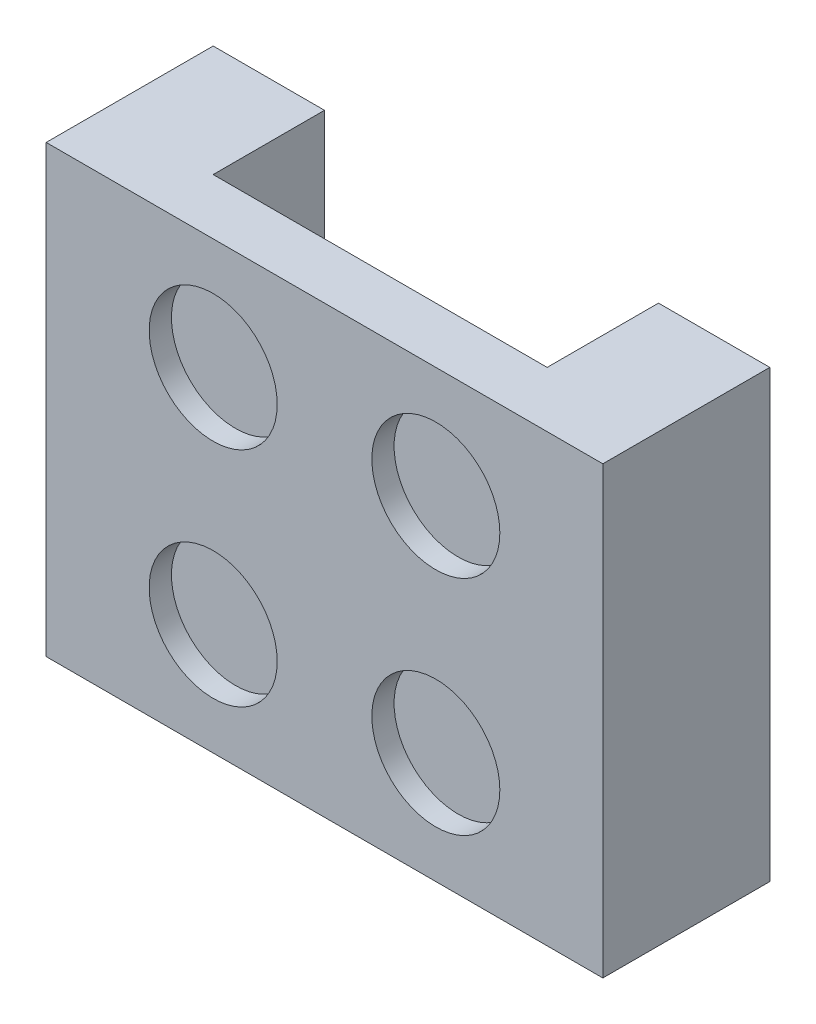
ISO-10303-21;
HEADER;
FILE_DESCRIPTION(('STEP AP214'),'2;1');
FILE_NAME('part.step','',(''),(''),'','','');
FILE_SCHEMA(('AUTOMOTIVE_DESIGN { 1 0 10303 214 1 1 1 1 }'));
ENDSEC;
DATA;
#1=APPLICATION_CONTEXT('core data for automotive mechanical design processes');
#2=APPLICATION_PROTOCOL_DEFINITION('international standard','automotive_design',2000,#1);
#3=PRODUCT_CONTEXT('',#1,'mechanical');
#4=PRODUCT('Part','Part','',(#3));
#5=PRODUCT_RELATED_PRODUCT_CATEGORY('part','',(#4));
#6=PRODUCT_DEFINITION_FORMATION('','',#4);
#7=PRODUCT_DEFINITION_CONTEXT('part definition',#1,'design');
#8=PRODUCT_DEFINITION('design','',#6,#7);
#9=PRODUCT_DEFINITION_SHAPE('','',#8);
#10=(LENGTH_UNIT() NAMED_UNIT(*) SI_UNIT(.MILLI.,.METRE.));
#11=(NAMED_UNIT(*) PLANE_ANGLE_UNIT() SI_UNIT($,.RADIAN.));
#12=(NAMED_UNIT(*) SI_UNIT($,.STERADIAN.) SOLID_ANGLE_UNIT());
#13=UNCERTAINTY_MEASURE_WITH_UNIT(LENGTH_MEASURE(1.E-05),#10,'distance_accuracy_value','');
#14=(GEOMETRIC_REPRESENTATION_CONTEXT(3) GLOBAL_UNCERTAINTY_ASSIGNED_CONTEXT((#13)) GLOBAL_UNIT_ASSIGNED_CONTEXT((#10,
#11,#12)) REPRESENTATION_CONTEXT('',''));
#15=CARTESIAN_POINT('',(0.,0.,0.));
#16=DIRECTION('',(0.,0.,1.));
#17=DIRECTION('',(1.,0.,0.));
#18=AXIS2_PLACEMENT_3D('',#15,#16,#17);
#19=CARTESIAN_POINT('',(10.,40.,0.));
#20=DIRECTION('',(0.,0.,1.));
#21=DIRECTION('',(1.,0.,0.));
#22=AXIS2_PLACEMENT_3D('',#19,#20,#21);
#23=PLANE('',#22);
#24=DIRECTION('',(-1.,0.,0.));
#25=VECTOR('',#24,1.);
#26=CARTESIAN_POINT('',(10.,0.,0.));
#27=LINE('',#26,#25);
#28=CARTESIAN_POINT('',(10.,0.,0.));
#29=VERTEX_POINT('',#28);
#30=CARTESIAN_POINT('',(0.,0.,0.));
#31=VERTEX_POINT('',#30);
#32=EDGE_CURVE('E135',#29,#31,#27,.T.);
#33=ORIENTED_EDGE('',*,*,#32,.T.);
#34=DIRECTION('',(0.,-1.,0.));
#35=VECTOR('',#34,1.);
#36=CARTESIAN_POINT('',(0.,40.,0.));
#37=LINE('',#36,#35);
#38=CARTESIAN_POINT('',(0.,40.,0.));
#39=VERTEX_POINT('',#38);
#40=EDGE_CURVE('E11',#39,#31,#37,.T.);
#41=ORIENTED_EDGE('',*,*,#40,.F.);
#42=DIRECTION('',(-1.,0.,0.));
#43=VECTOR('',#42,1.);
#44=CARTESIAN_POINT('',(10.,40.,0.));
#45=LINE('',#44,#43);
#46=CARTESIAN_POINT('',(10.,40.,0.));
#47=VERTEX_POINT('',#46);
#48=EDGE_CURVE('E150',#47,#39,#45,.T.);
#49=ORIENTED_EDGE('',*,*,#48,.F.);
#50=DIRECTION('',(0.,-1.,0.));
#51=VECTOR('',#50,1.);
#52=CARTESIAN_POINT('',(10.,40.,0.));
#53=LINE('',#52,#51);
#54=EDGE_CURVE('E131',#47,#29,#53,.T.);
#55=ORIENTED_EDGE('',*,*,#54,.T.);
#56=EDGE_LOOP('',(#33,#41,#49,#55));
#57=FACE_BOUND('',#56,.T.);
#58=ADVANCED_FACE('F39',(#57),#23,.F.);
#59=CARTESIAN_POINT('',(0.,40.,0.));
#60=DIRECTION('',(1.,0.,0.));
#61=DIRECTION('',(0.,0.,-1.));
#62=AXIS2_PLACEMENT_3D('',#59,#60,#61);
#63=PLANE('',#62);
#64=DIRECTION('',(0.,0.,1.));
#65=VECTOR('',#64,1.);
#66=CARTESIAN_POINT('',(0.,0.,0.));
#67=LINE('',#66,#65);
#68=CARTESIAN_POINT('',(0.,0.,15.));
#69=VERTEX_POINT('',#68);
#70=EDGE_CURVE('E138',#31,#69,#67,.T.);
#71=ORIENTED_EDGE('',*,*,#70,.T.);
#72=DIRECTION('',(0.,-1.,0.));
#73=VECTOR('',#72,1.);
#74=CARTESIAN_POINT('',(0.,40.,15.));
#75=LINE('',#74,#73);
#76=CARTESIAN_POINT('',(0.,40.,15.));
#77=VERTEX_POINT('',#76);
#78=EDGE_CURVE('E47',#77,#69,#75,.T.);
#79=ORIENTED_EDGE('',*,*,#78,.F.);
#80=DIRECTION('',(0.,0.,1.));
#81=VECTOR('',#80,1.);
#82=CARTESIAN_POINT('',(0.,40.,0.));
#83=LINE('',#82,#81);
#84=EDGE_CURVE('E98',#39,#77,#83,.T.);
#85=ORIENTED_EDGE('',*,*,#84,.F.);
#86=ORIENTED_EDGE('',*,*,#40,.T.);
#87=EDGE_LOOP('',(#71,#79,#85,#86));
#88=FACE_BOUND('',#87,.T.);
#89=ADVANCED_FACE('F211',(#88),#63,.F.);
#90=CARTESIAN_POINT('',(0.,40.,15.));
#91=DIRECTION('',(0.,0.,-1.));
#92=DIRECTION('',(-1.,0.,0.));
#93=AXIS2_PLACEMENT_3D('',#90,#91,#92);
#94=PLANE('',#93);
#95=CARTESIAN_POINT('',(35.,30.,15.));
#96=DIRECTION('',(0.,0.,1.));
#97=DIRECTION('',(1.,0.,0.));
#98=AXIS2_PLACEMENT_3D('',#95,#96,#97);
#99=CIRCLE('',#98,5.74999999999999);
#100=CARTESIAN_POINT('',(40.75,30.,15.));
#101=VERTEX_POINT('',#100);
#102=EDGE_CURVE('E186',#101,#101,#99,.T.);
#103=ORIENTED_EDGE('',*,*,#102,.F.);
#104=EDGE_LOOP('',(#103));
#105=FACE_BOUND('',#104,.T.);
#106=CARTESIAN_POINT('',(15.,10.,15.));
#107=DIRECTION('',(0.,0.,1.));
#108=DIRECTION('',(1.,0.,0.));
#109=AXIS2_PLACEMENT_3D('',#106,#107,#108);
#110=CIRCLE('',#109,5.75);
#111=CARTESIAN_POINT('',(20.75,10.,15.));
#112=VERTEX_POINT('',#111);
#113=EDGE_CURVE('E192',#112,#112,#110,.T.);
#114=ORIENTED_EDGE('',*,*,#113,.F.);
#115=EDGE_LOOP('',(#114));
#116=FACE_BOUND('',#115,.T.);
#117=CARTESIAN_POINT('',(35.,10.,15.));
#118=DIRECTION('',(0.,0.,1.));
#119=DIRECTION('',(1.,0.,0.));
#120=AXIS2_PLACEMENT_3D('',#117,#118,#119);
#121=CIRCLE('',#120,5.75);
#122=CARTESIAN_POINT('',(40.75,10.,15.));
#123=VERTEX_POINT('',#122);
#124=EDGE_CURVE('E193',#123,#123,#121,.T.);
#125=ORIENTED_EDGE('',*,*,#124,.F.);
#126=EDGE_LOOP('',(#125));
#127=FACE_BOUND('',#126,.T.);
#128=CARTESIAN_POINT('',(15.,30.,15.));
#129=DIRECTION('',(0.,0.,1.));
#130=DIRECTION('',(1.,0.,0.));
#131=AXIS2_PLACEMENT_3D('',#128,#129,#130);
#132=CIRCLE('',#131,5.75);
#133=CARTESIAN_POINT('',(20.75,30.,15.));
#134=VERTEX_POINT('',#133);
#135=EDGE_CURVE('E183',#134,#134,#132,.T.);
#136=ORIENTED_EDGE('',*,*,#135,.F.);
#137=EDGE_LOOP('',(#136));
#138=FACE_BOUND('',#137,.T.);
#139=DIRECTION('',(1.,0.,0.));
#140=VECTOR('',#139,1.);
#141=CARTESIAN_POINT('',(0.,0.,15.));
#142=LINE('',#141,#140);
#143=CARTESIAN_POINT('',(50.,0.,15.));
#144=VERTEX_POINT('',#143);
#145=EDGE_CURVE('E141',#69,#144,#142,.T.);
#146=ORIENTED_EDGE('',*,*,#145,.T.);
#147=DIRECTION('',(0.,-1.,0.));
#148=VECTOR('',#147,1.);
#149=CARTESIAN_POINT('',(50.,40.,15.));
#150=LINE('',#149,#148);
#151=CARTESIAN_POINT('',(50.,40.,15.));
#152=VERTEX_POINT('',#151);
#153=EDGE_CURVE('E157',#152,#144,#150,.T.);
#154=ORIENTED_EDGE('',*,*,#153,.F.);
#155=DIRECTION('',(1.,0.,0.));
#156=VECTOR('',#155,1.);
#157=CARTESIAN_POINT('',(0.,40.,15.));
#158=LINE('',#157,#156);
#159=EDGE_CURVE('E165',#77,#152,#158,.T.);
#160=ORIENTED_EDGE('',*,*,#159,.F.);
#161=ORIENTED_EDGE('',*,*,#78,.T.);
#162=EDGE_LOOP('',(#146,#154,#160,#161));
#163=FACE_BOUND('',#162,.T.);
#164=ADVANCED_FACE('F163',(#105,#116,#127,#138,#163),#94,.F.);
#165=CARTESIAN_POINT('',(50.,40.,15.));
#166=DIRECTION('',(-1.,0.,0.));
#167=DIRECTION('',(0.,0.,1.));
#168=AXIS2_PLACEMENT_3D('',#165,#166,#167);
#169=PLANE('',#168);
#170=DIRECTION('',(0.,0.,-1.));
#171=VECTOR('',#170,1.);
#172=CARTESIAN_POINT('',(50.,0.,15.));
#173=LINE('',#172,#171);
#174=CARTESIAN_POINT('',(50.,0.,0.));
#175=VERTEX_POINT('',#174);
#176=EDGE_CURVE('E143',#144,#175,#173,.T.);
#177=ORIENTED_EDGE('',*,*,#176,.T.);
#178=DIRECTION('',(0.,-1.,0.));
#179=VECTOR('',#178,1.);
#180=CARTESIAN_POINT('',(50.,40.,0.));
#181=LINE('',#180,#179);
#182=CARTESIAN_POINT('',(50.,40.,0.));
#183=VERTEX_POINT('',#182);
#184=EDGE_CURVE('E154',#183,#175,#181,.T.);
#185=ORIENTED_EDGE('',*,*,#184,.F.);
#186=DIRECTION('',(0.,0.,-1.));
#187=VECTOR('',#186,1.);
#188=CARTESIAN_POINT('',(50.,40.,15.));
#189=LINE('',#188,#187);
#190=EDGE_CURVE('E177',#152,#183,#189,.T.);
#191=ORIENTED_EDGE('',*,*,#190,.F.);
#192=ORIENTED_EDGE('',*,*,#153,.T.);
#193=EDGE_LOOP('',(#177,#185,#191,#192));
#194=FACE_BOUND('',#193,.T.);
#195=ADVANCED_FACE('F173',(#194),#169,.F.);
#196=CARTESIAN_POINT('',(50.,40.,0.));
#197=DIRECTION('',(0.,0.,1.));
#198=DIRECTION('',(1.,0.,0.));
#199=AXIS2_PLACEMENT_3D('',#196,#197,#198);
#200=PLANE('',#199);
#201=DIRECTION('',(-1.,0.,0.));
#202=VECTOR('',#201,1.);
#203=CARTESIAN_POINT('',(50.,0.,0.));
#204=LINE('',#203,#202);
#205=CARTESIAN_POINT('',(40.,0.,0.));
#206=VERTEX_POINT('',#205);
#207=EDGE_CURVE('E145',#175,#206,#204,.T.);
#208=ORIENTED_EDGE('',*,*,#207,.T.);
#209=DIRECTION('',(0.,-1.,0.));
#210=VECTOR('',#209,1.);
#211=CARTESIAN_POINT('',(40.,40.,0.));
#212=LINE('',#211,#210);
#213=CARTESIAN_POINT('',(40.,40.,0.));
#214=VERTEX_POINT('',#213);
#215=EDGE_CURVE('E126',#214,#206,#212,.T.);
#216=ORIENTED_EDGE('',*,*,#215,.F.);
#217=DIRECTION('',(-1.,0.,0.));
#218=VECTOR('',#217,1.);
#219=CARTESIAN_POINT('',(50.,40.,0.));
#220=LINE('',#219,#218);
#221=EDGE_CURVE('E117',#183,#214,#220,.T.);
#222=ORIENTED_EDGE('',*,*,#221,.F.);
#223=ORIENTED_EDGE('',*,*,#184,.T.);
#224=EDGE_LOOP('',(#208,#216,#222,#223));
#225=FACE_BOUND('',#224,.T.);
#226=ADVANCED_FACE('F176',(#225),#200,.F.);
#227=CARTESIAN_POINT('',(40.,40.,0.));
#228=DIRECTION('',(1.,0.,0.));
#229=DIRECTION('',(0.,0.,-1.));
#230=AXIS2_PLACEMENT_3D('',#227,#228,#229);
#231=PLANE('',#230);
#232=DIRECTION('',(0.,0.,1.));
#233=VECTOR('',#232,1.);
#234=CARTESIAN_POINT('',(40.,0.,0.));
#235=LINE('',#234,#233);
#236=CARTESIAN_POINT('',(40.,0.,10.));
#237=VERTEX_POINT('',#236);
#238=EDGE_CURVE('E125',#206,#237,#235,.T.);
#239=ORIENTED_EDGE('',*,*,#238,.T.);
#240=DIRECTION('',(0.,-1.,0.));
#241=VECTOR('',#240,1.);
#242=CARTESIAN_POINT('',(40.,40.,10.));
#243=LINE('',#242,#241);
#244=CARTESIAN_POINT('',(40.,40.,10.));
#245=VERTEX_POINT('',#244);
#246=EDGE_CURVE('E122',#245,#237,#243,.T.);
#247=ORIENTED_EDGE('',*,*,#246,.F.);
#248=DIRECTION('',(0.,0.,1.));
#249=VECTOR('',#248,1.);
#250=CARTESIAN_POINT('',(40.,40.,0.));
#251=LINE('',#250,#249);
#252=EDGE_CURVE('E111',#214,#245,#251,.T.);
#253=ORIENTED_EDGE('',*,*,#252,.F.);
#254=ORIENTED_EDGE('',*,*,#215,.T.);
#255=EDGE_LOOP('',(#239,#247,#253,#254));
#256=FACE_BOUND('',#255,.T.);
#257=ADVANCED_FACE('F123',(#256),#231,.F.);
#258=CARTESIAN_POINT('',(40.,40.,10.));
#259=DIRECTION('',(0.,0.,1.));
#260=DIRECTION('',(1.,0.,0.));
#261=AXIS2_PLACEMENT_3D('',#258,#259,#260);
#262=PLANE('',#261);
#263=DIRECTION('',(-1.,0.,0.));
#264=VECTOR('',#263,1.);
#265=CARTESIAN_POINT('',(40.,0.,10.));
#266=LINE('',#265,#264);
#267=CARTESIAN_POINT('',(10.,0.,10.));
#268=VERTEX_POINT('',#267);
#269=EDGE_CURVE('E84',#237,#268,#266,.T.);
#270=ORIENTED_EDGE('',*,*,#269,.T.);
#271=DIRECTION('',(0.,-1.,0.));
#272=VECTOR('',#271,1.);
#273=CARTESIAN_POINT('',(10.,40.,10.));
#274=LINE('',#273,#272);
#275=CARTESIAN_POINT('',(10.,40.,10.));
#276=VERTEX_POINT('',#275);
#277=EDGE_CURVE('E127',#276,#268,#274,.T.);
#278=ORIENTED_EDGE('',*,*,#277,.F.);
#279=DIRECTION('',(-1.,0.,0.));
#280=VECTOR('',#279,1.);
#281=CARTESIAN_POINT('',(40.,40.,10.));
#282=LINE('',#281,#280);
#283=EDGE_CURVE('E115',#245,#276,#282,.T.);
#284=ORIENTED_EDGE('',*,*,#283,.F.);
#285=ORIENTED_EDGE('',*,*,#246,.T.);
#286=EDGE_LOOP('',(#270,#278,#284,#285));
#287=FACE_BOUND('',#286,.T.);
#288=ADVANCED_FACE('F129',(#287),#262,.F.);
#289=CARTESIAN_POINT('',(10.,40.,10.));
#290=DIRECTION('',(-1.,0.,0.));
#291=DIRECTION('',(0.,0.,1.));
#292=AXIS2_PLACEMENT_3D('',#289,#290,#291);
#293=PLANE('',#292);
#294=DIRECTION('',(0.,0.,-1.));
#295=VECTOR('',#294,1.);
#296=CARTESIAN_POINT('',(10.,0.,10.));
#297=LINE('',#296,#295);
#298=EDGE_CURVE('E90',#268,#29,#297,.T.);
#299=ORIENTED_EDGE('',*,*,#298,.T.);
#300=ORIENTED_EDGE('',*,*,#54,.F.);
#301=DIRECTION('',(0.,0.,-1.));
#302=VECTOR('',#301,1.);
#303=CARTESIAN_POINT('',(10.,40.,10.));
#304=LINE('',#303,#302);
#305=EDGE_CURVE('E55',#276,#47,#304,.T.);
#306=ORIENTED_EDGE('',*,*,#305,.F.);
#307=ORIENTED_EDGE('',*,*,#277,.T.);
#308=EDGE_LOOP('',(#299,#300,#306,#307));
#309=FACE_BOUND('',#308,.T.);
#310=ADVANCED_FACE('F237',(#309),#293,.F.);
#311=CARTESIAN_POINT('',(0.,40.,0.));
#312=DIRECTION('',(0.,1.,0.));
#313=DIRECTION('',(0.,0.,1.));
#314=AXIS2_PLACEMENT_3D('',#311,#312,#313);
#315=PLANE('',#314);
#316=ORIENTED_EDGE('',*,*,#48,.T.);
#317=ORIENTED_EDGE('',*,*,#84,.T.);
#318=ORIENTED_EDGE('',*,*,#159,.T.);
#319=ORIENTED_EDGE('',*,*,#190,.T.);
#320=ORIENTED_EDGE('',*,*,#221,.T.);
#321=ORIENTED_EDGE('',*,*,#252,.T.);
#322=ORIENTED_EDGE('',*,*,#283,.T.);
#323=ORIENTED_EDGE('',*,*,#305,.T.);
#324=EDGE_LOOP('',(#316,#317,#318,#319,#320,#321,#322,#323));
#325=FACE_BOUND('',#324,.T.);
#326=ADVANCED_FACE('F113',(#325),#315,.T.);
#327=CARTESIAN_POINT('',(0.,0.,0.));
#328=DIRECTION('',(0.,1.,0.));
#329=DIRECTION('',(0.,0.,1.));
#330=AXIS2_PLACEMENT_3D('',#327,#328,#329);
#331=PLANE('',#330);
#332=ORIENTED_EDGE('',*,*,#32,.F.);
#333=ORIENTED_EDGE('',*,*,#298,.F.);
#334=ORIENTED_EDGE('',*,*,#269,.F.);
#335=ORIENTED_EDGE('',*,*,#238,.F.);
#336=ORIENTED_EDGE('',*,*,#207,.F.);
#337=ORIENTED_EDGE('',*,*,#176,.F.);
#338=ORIENTED_EDGE('',*,*,#145,.F.);
#339=ORIENTED_EDGE('',*,*,#70,.F.);
#340=EDGE_LOOP('',(#332,#333,#334,#335,#336,#337,#338,#339));
#341=FACE_BOUND('',#340,.T.);
#342=ADVANCED_FACE('F169',(#341),#331,.F.);
#343=CARTESIAN_POINT('',(15.,30.,13.));
#344=DIRECTION('',(0.,0.,1.));
#345=DIRECTION('',(1.,0.,0.));
#346=AXIS2_PLACEMENT_3D('',#343,#344,#345);
#347=CYLINDRICAL_SURFACE('',#346,5.75);
#348=CARTESIAN_POINT('',(15.,30.,13.));
#349=DIRECTION('',(0.,0.,1.));
#350=DIRECTION('',(1.,0.,0.));
#351=AXIS2_PLACEMENT_3D('',#348,#349,#350);
#352=CIRCLE('',#351,5.75);
#353=CARTESIAN_POINT('',(20.75,30.,13.));
#354=VERTEX_POINT('',#353);
#355=EDGE_CURVE('E139',#354,#354,#352,.T.);
#356=ORIENTED_EDGE('',*,*,#355,.F.);
#357=EDGE_LOOP('',(#356));
#358=FACE_BOUND('',#357,.T.);
#359=ORIENTED_EDGE('',*,*,#135,.T.);
#360=EDGE_LOOP('',(#359));
#361=FACE_BOUND('',#360,.T.);
#362=ADVANCED_FACE('F216',(#358,#361),#347,.F.);
#363=CARTESIAN_POINT('',(15.,30.,13.));
#364=DIRECTION('',(0.,0.,1.));
#365=DIRECTION('',(1.,0.,0.));
#366=AXIS2_PLACEMENT_3D('',#363,#364,#365);
#367=PLANE('',#366);
#368=ORIENTED_EDGE('',*,*,#355,.T.);
#369=EDGE_LOOP('',(#368));
#370=FACE_BOUND('',#369,.T.);
#371=ADVANCED_FACE('F218',(#370),#367,.T.);
#372=CARTESIAN_POINT('',(35.,10.,13.));
#373=DIRECTION('',(0.,0.,1.));
#374=DIRECTION('',(1.,0.,0.));
#375=AXIS2_PLACEMENT_3D('',#372,#373,#374);
#376=CYLINDRICAL_SURFACE('',#375,5.75);
#377=CARTESIAN_POINT('',(35.,10.,13.));
#378=DIRECTION('',(0.,0.,1.));
#379=DIRECTION('',(1.,0.,0.));
#380=AXIS2_PLACEMENT_3D('',#377,#378,#379);
#381=CIRCLE('',#380,5.75);
#382=CARTESIAN_POINT('',(40.75,10.,13.));
#383=VERTEX_POINT('',#382);
#384=EDGE_CURVE('E201',#383,#383,#381,.T.);
#385=ORIENTED_EDGE('',*,*,#384,.F.);
#386=EDGE_LOOP('',(#385));
#387=FACE_BOUND('',#386,.T.);
#388=ORIENTED_EDGE('',*,*,#124,.T.);
#389=EDGE_LOOP('',(#388));
#390=FACE_BOUND('',#389,.T.);
#391=ADVANCED_FACE('F207',(#387,#390),#376,.F.);
#392=CARTESIAN_POINT('',(35.,10.,13.));
#393=DIRECTION('',(0.,0.,1.));
#394=DIRECTION('',(1.,0.,0.));
#395=AXIS2_PLACEMENT_3D('',#392,#393,#394);
#396=PLANE('',#395);
#397=ORIENTED_EDGE('',*,*,#384,.T.);
#398=EDGE_LOOP('',(#397));
#399=FACE_BOUND('',#398,.T.);
#400=ADVANCED_FACE('F315',(#399),#396,.T.);
#401=CARTESIAN_POINT('',(15.,10.,13.));
#402=DIRECTION('',(0.,0.,1.));
#403=DIRECTION('',(1.,0.,0.));
#404=AXIS2_PLACEMENT_3D('',#401,#402,#403);
#405=CYLINDRICAL_SURFACE('',#404,5.75);
#406=CARTESIAN_POINT('',(15.,10.,13.));
#407=DIRECTION('',(0.,0.,1.));
#408=DIRECTION('',(1.,0.,0.));
#409=AXIS2_PLACEMENT_3D('',#406,#407,#408);
#410=CIRCLE('',#409,5.75);
#411=CARTESIAN_POINT('',(20.75,10.,13.));
#412=VERTEX_POINT('',#411);
#413=EDGE_CURVE('E189',#412,#412,#410,.T.);
#414=ORIENTED_EDGE('',*,*,#413,.F.);
#415=EDGE_LOOP('',(#414));
#416=FACE_BOUND('',#415,.T.);
#417=ORIENTED_EDGE('',*,*,#113,.T.);
#418=EDGE_LOOP('',(#417));
#419=FACE_BOUND('',#418,.T.);
#420=ADVANCED_FACE('F326',(#416,#419),#405,.F.);
#421=CARTESIAN_POINT('',(15.,10.,13.));
#422=DIRECTION('',(0.,0.,1.));
#423=DIRECTION('',(1.,0.,0.));
#424=AXIS2_PLACEMENT_3D('',#421,#422,#423);
#425=PLANE('',#424);
#426=ORIENTED_EDGE('',*,*,#413,.T.);
#427=EDGE_LOOP('',(#426));
#428=FACE_BOUND('',#427,.T.);
#429=ADVANCED_FACE('F337',(#428),#425,.T.);
#430=CARTESIAN_POINT('',(35.,30.,13.));
#431=DIRECTION('',(0.,0.,1.));
#432=DIRECTION('',(1.,0.,0.));
#433=AXIS2_PLACEMENT_3D('',#430,#431,#432);
#434=CYLINDRICAL_SURFACE('',#433,5.74999999999999);
#435=CARTESIAN_POINT('',(35.,30.,13.));
#436=DIRECTION('',(0.,0.,1.));
#437=DIRECTION('',(1.,0.,0.));
#438=AXIS2_PLACEMENT_3D('',#435,#436,#437);
#439=CIRCLE('',#438,5.74999999999999);
#440=CARTESIAN_POINT('',(40.75,30.,13.));
#441=VERTEX_POINT('',#440);
#442=EDGE_CURVE('E196',#441,#441,#439,.T.);
#443=ORIENTED_EDGE('',*,*,#442,.F.);
#444=EDGE_LOOP('',(#443));
#445=FACE_BOUND('',#444,.T.);
#446=ORIENTED_EDGE('',*,*,#102,.T.);
#447=EDGE_LOOP('',(#446));
#448=FACE_BOUND('',#447,.T.);
#449=ADVANCED_FACE('F348',(#445,#448),#434,.F.);
#450=CARTESIAN_POINT('',(35.,30.,13.));
#451=DIRECTION('',(0.,0.,1.));
#452=DIRECTION('',(1.,0.,0.));
#453=AXIS2_PLACEMENT_3D('',#450,#451,#452);
#454=PLANE('',#453);
#455=ORIENTED_EDGE('',*,*,#442,.T.);
#456=EDGE_LOOP('',(#455));
#457=FACE_BOUND('',#456,.T.);
#458=ADVANCED_FACE('F359',(#457),#454,.T.);
#459=CLOSED_SHELL('',(#58,#89,#164,#195,#226,#257,#288,#310,#326,#342,#362,#371,#391,#400,#420,
#429,#449,#458));
#460=MANIFOLD_SOLID_BREP('B2',#459);
#461=ADVANCED_BREP_SHAPE_REPRESENTATION('',(#18,#460),#14);
#462=SHAPE_DEFINITION_REPRESENTATION(#9,#461);
ENDSEC;
END-ISO-10303-21;
